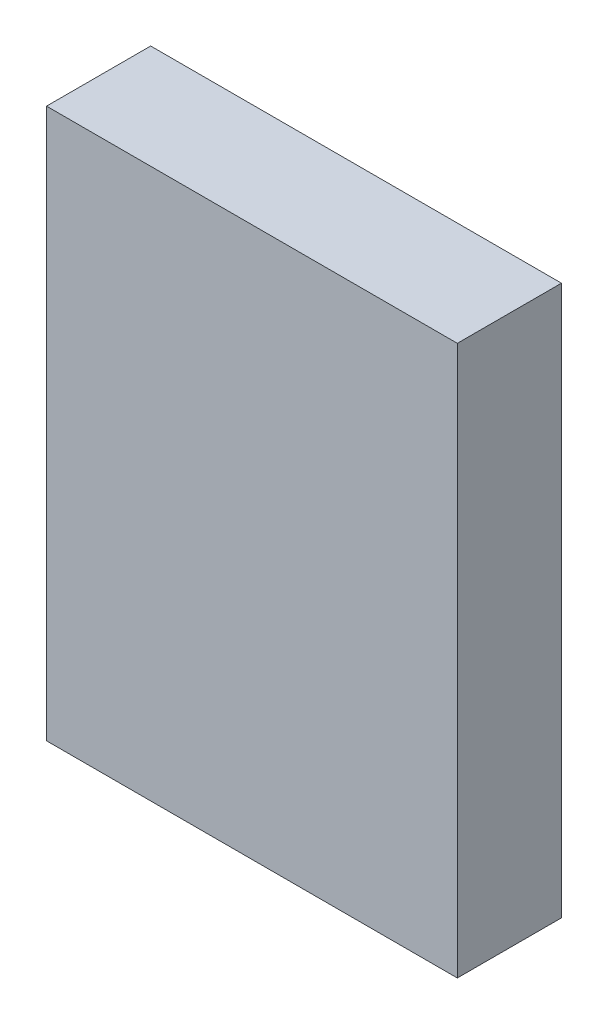
ISO-10303-21;
HEADER;
FILE_DESCRIPTION(('STEP AP214'),'2;1');
FILE_NAME('part.step','',(''),(''),'','','');
FILE_SCHEMA(('AUTOMOTIVE_DESIGN { 1 0 10303 214 1 1 1 1 }'));
ENDSEC;
DATA;
#1=APPLICATION_CONTEXT('core data for automotive mechanical design processes');
#2=APPLICATION_PROTOCOL_DEFINITION('international standard','automotive_design',2000,#1);
#3=PRODUCT_CONTEXT('',#1,'mechanical');
#4=PRODUCT('Part','Part','',(#3));
#5=PRODUCT_RELATED_PRODUCT_CATEGORY('part','',(#4));
#6=PRODUCT_DEFINITION_FORMATION('','',#4);
#7=PRODUCT_DEFINITION_CONTEXT('part definition',#1,'design');
#8=PRODUCT_DEFINITION('design','',#6,#7);
#9=PRODUCT_DEFINITION_SHAPE('','',#8);
#10=(LENGTH_UNIT() NAMED_UNIT(*) SI_UNIT(.MILLI.,.METRE.));
#11=(NAMED_UNIT(*) PLANE_ANGLE_UNIT() SI_UNIT($,.RADIAN.));
#12=(NAMED_UNIT(*) SI_UNIT($,.STERADIAN.) SOLID_ANGLE_UNIT());
#13=UNCERTAINTY_MEASURE_WITH_UNIT(LENGTH_MEASURE(1.E-05),#10,'distance_accuracy_value','');
#14=(GEOMETRIC_REPRESENTATION_CONTEXT(3) GLOBAL_UNCERTAINTY_ASSIGNED_CONTEXT((#13)) GLOBAL_UNIT_ASSIGNED_CONTEXT((#10,
#11,#12)) REPRESENTATION_CONTEXT('',''));
#15=CARTESIAN_POINT('',(0.,0.,0.));
#16=DIRECTION('',(0.,0.,1.));
#17=DIRECTION('',(1.,0.,0.));
#18=AXIS2_PLACEMENT_3D('',#15,#16,#17);
#19=CARTESIAN_POINT('',(-1.77500026,-2.37499906,0.90000074));
#20=DIRECTION('',(0.,0.,-1.));
#21=DIRECTION('',(-1.,0.,0.));
#22=AXIS2_PLACEMENT_3D('',#19,#20,#21);
#23=PLANE('',#22);
#24=DIRECTION('',(0.,1.,0.));
#25=VECTOR('',#24,1.);
#26=CARTESIAN_POINT('',(1.77500026,-2.37499906,0.90000074));
#27=LINE('',#26,#25);
#28=CARTESIAN_POINT('',(1.77500026,-2.37499906,0.90000074));
#29=VERTEX_POINT('',#28);
#30=CARTESIAN_POINT('',(1.77500026,2.3750016,0.90000074));
#31=VERTEX_POINT('',#30);
#32=EDGE_CURVE('E79',#29,#31,#27,.T.);
#33=ORIENTED_EDGE('',*,*,#32,.T.);
#34=DIRECTION('',(1.,0.,0.));
#35=VECTOR('',#34,1.);
#36=CARTESIAN_POINT('',(1.77500026,2.3750016,0.90000074));
#37=LINE('',#36,#35);
#38=CARTESIAN_POINT('',(-1.77500026,2.3750016,0.90000074));
#39=VERTEX_POINT('',#38);
#40=EDGE_CURVE('E55',#31,#39,#37,.F.);
#41=ORIENTED_EDGE('',*,*,#40,.T.);
#42=DIRECTION('',(0.,1.,0.));
#43=VECTOR('',#42,1.);
#44=CARTESIAN_POINT('',(-1.77500026,2.3750016,0.90000074));
#45=LINE('',#44,#43);
#46=CARTESIAN_POINT('',(-1.77500026,-2.37499906,0.90000074));
#47=VERTEX_POINT('',#46);
#48=EDGE_CURVE('E57',#39,#47,#45,.F.);
#49=ORIENTED_EDGE('',*,*,#48,.T.);
#50=DIRECTION('',(1.,0.,0.));
#51=VECTOR('',#50,1.);
#52=CARTESIAN_POINT('',(-1.77500026,-2.37499906,0.90000074));
#53=LINE('',#52,#51);
#54=EDGE_CURVE('E20',#47,#29,#53,.T.);
#55=ORIENTED_EDGE('',*,*,#54,.T.);
#56=EDGE_LOOP('',(#33,#41,#49,#55));
#57=FACE_BOUND('',#56,.T.);
#58=ADVANCED_FACE('F17',(#57),#23,.F.);
#59=CARTESIAN_POINT('',(-1.77500026,-2.37499906,0.));
#60=DIRECTION('',(0.,1.,0.));
#61=DIRECTION('',(0.,0.,1.));
#62=AXIS2_PLACEMENT_3D('',#59,#60,#61);
#63=PLANE('',#62);
#64=DIRECTION('',(-1.,0.,0.));
#65=VECTOR('',#64,1.);
#66=CARTESIAN_POINT('',(-1.77500026,-2.37499906,0.));
#67=LINE('',#66,#65);
#68=CARTESIAN_POINT('',(1.77500026,-2.37499906,0.));
#69=VERTEX_POINT('',#68);
#70=CARTESIAN_POINT('',(-1.77500026,-2.37499906,0.));
#71=VERTEX_POINT('',#70);
#72=EDGE_CURVE('E83',#69,#71,#67,.T.);
#73=ORIENTED_EDGE('',*,*,#72,.F.);
#74=DIRECTION('',(0.,0.,1.));
#75=VECTOR('',#74,1.);
#76=CARTESIAN_POINT('',(1.77500026,-2.37499906,0.));
#77=LINE('',#76,#75);
#78=EDGE_CURVE('E68',#69,#29,#77,.T.);
#79=ORIENTED_EDGE('',*,*,#78,.T.);
#80=ORIENTED_EDGE('',*,*,#54,.F.);
#81=DIRECTION('',(0.,0.,-1.));
#82=VECTOR('',#81,1.);
#83=CARTESIAN_POINT('',(-1.77500026,-2.37499906,0.));
#84=LINE('',#83,#82);
#85=EDGE_CURVE('E63',#47,#71,#84,.T.);
#86=ORIENTED_EDGE('',*,*,#85,.T.);
#87=EDGE_LOOP('',(#73,#79,#80,#86));
#88=FACE_BOUND('',#87,.T.);
#89=ADVANCED_FACE('F65',(#88),#63,.F.);
#90=CARTESIAN_POINT('',(-1.77500026,2.3750016,0.));
#91=DIRECTION('',(1.,0.,0.));
#92=DIRECTION('',(0.,0.,-1.));
#93=AXIS2_PLACEMENT_3D('',#90,#91,#92);
#94=PLANE('',#93);
#95=DIRECTION('',(0.,1.,0.));
#96=VECTOR('',#95,1.);
#97=CARTESIAN_POINT('',(-1.77500026,-2.37499906,0.));
#98=LINE('',#97,#96);
#99=CARTESIAN_POINT('',(-1.77500026,2.3750016,0.));
#100=VERTEX_POINT('',#99);
#101=EDGE_CURVE('E72',#71,#100,#98,.T.);
#102=ORIENTED_EDGE('',*,*,#101,.F.);
#103=ORIENTED_EDGE('',*,*,#85,.F.);
#104=ORIENTED_EDGE('',*,*,#48,.F.);
#105=DIRECTION('',(0.,0.,-1.));
#106=VECTOR('',#105,1.);
#107=CARTESIAN_POINT('',(-1.77500026,2.3750016,0.));
#108=LINE('',#107,#106);
#109=EDGE_CURVE('E75',#39,#100,#108,.T.);
#110=ORIENTED_EDGE('',*,*,#109,.T.);
#111=EDGE_LOOP('',(#102,#103,#104,#110));
#112=FACE_BOUND('',#111,.T.);
#113=ADVANCED_FACE('F70',(#112),#94,.F.);
#114=CARTESIAN_POINT('',(1.77500026,2.3750016,0.));
#115=DIRECTION('',(0.,-1.,0.));
#116=DIRECTION('',(0.,0.,-1.));
#117=AXIS2_PLACEMENT_3D('',#114,#115,#116);
#118=PLANE('',#117);
#119=DIRECTION('',(-1.,0.,0.));
#120=VECTOR('',#119,1.);
#121=CARTESIAN_POINT('',(-1.77500026,2.3750016,0.));
#122=LINE('',#121,#120);
#123=CARTESIAN_POINT('',(1.77500026,2.3750016,0.));
#124=VERTEX_POINT('',#123);
#125=EDGE_CURVE('E26',#100,#124,#122,.F.);
#126=ORIENTED_EDGE('',*,*,#125,.F.);
#127=ORIENTED_EDGE('',*,*,#109,.F.);
#128=ORIENTED_EDGE('',*,*,#40,.F.);
#129=DIRECTION('',(0.,0.,1.));
#130=VECTOR('',#129,1.);
#131=CARTESIAN_POINT('',(1.77500026,2.3750016,0.));
#132=LINE('',#131,#130);
#133=EDGE_CURVE('E35',#31,#124,#132,.F.);
#134=ORIENTED_EDGE('',*,*,#133,.T.);
#135=EDGE_LOOP('',(#126,#127,#128,#134));
#136=FACE_BOUND('',#135,.T.);
#137=ADVANCED_FACE('F89',(#136),#118,.F.);
#138=CARTESIAN_POINT('',(1.77500026,-2.37499906,0.));
#139=DIRECTION('',(-1.,0.,0.));
#140=DIRECTION('',(0.,0.,1.));
#141=AXIS2_PLACEMENT_3D('',#138,#139,#140);
#142=PLANE('',#141);
#143=DIRECTION('',(0.,1.,0.));
#144=VECTOR('',#143,1.);
#145=CARTESIAN_POINT('',(1.77500026,-2.37499906,0.));
#146=LINE('',#145,#144);
#147=EDGE_CURVE('E11',#124,#69,#146,.F.);
#148=ORIENTED_EDGE('',*,*,#147,.F.);
#149=ORIENTED_EDGE('',*,*,#133,.F.);
#150=ORIENTED_EDGE('',*,*,#32,.F.);
#151=ORIENTED_EDGE('',*,*,#78,.F.);
#152=EDGE_LOOP('',(#148,#149,#150,#151));
#153=FACE_BOUND('',#152,.T.);
#154=ADVANCED_FACE('F91',(#153),#142,.F.);
#155=CARTESIAN_POINT('',(-1.77500026,-2.37499906,0.));
#156=DIRECTION('',(0.,0.,-1.));
#157=DIRECTION('',(-1.,0.,0.));
#158=AXIS2_PLACEMENT_3D('',#155,#156,#157);
#159=PLANE('',#158);
#160=ORIENTED_EDGE('',*,*,#125,.T.);
#161=ORIENTED_EDGE('',*,*,#147,.T.);
#162=ORIENTED_EDGE('',*,*,#72,.T.);
#163=ORIENTED_EDGE('',*,*,#101,.T.);
#164=EDGE_LOOP('',(#160,#161,#162,#163));
#165=FACE_BOUND('',#164,.T.);
#166=ADVANCED_FACE('F88',(#165),#159,.T.);
#167=CLOSED_SHELL('',(#58,#89,#113,#137,#154,#166));
#168=MANIFOLD_SOLID_BREP('B1',#167);
#169=ADVANCED_BREP_SHAPE_REPRESENTATION('',(#18,#168),#14);
#170=SHAPE_DEFINITION_REPRESENTATION(#9,#169);
ENDSEC;
END-ISO-10303-21;
